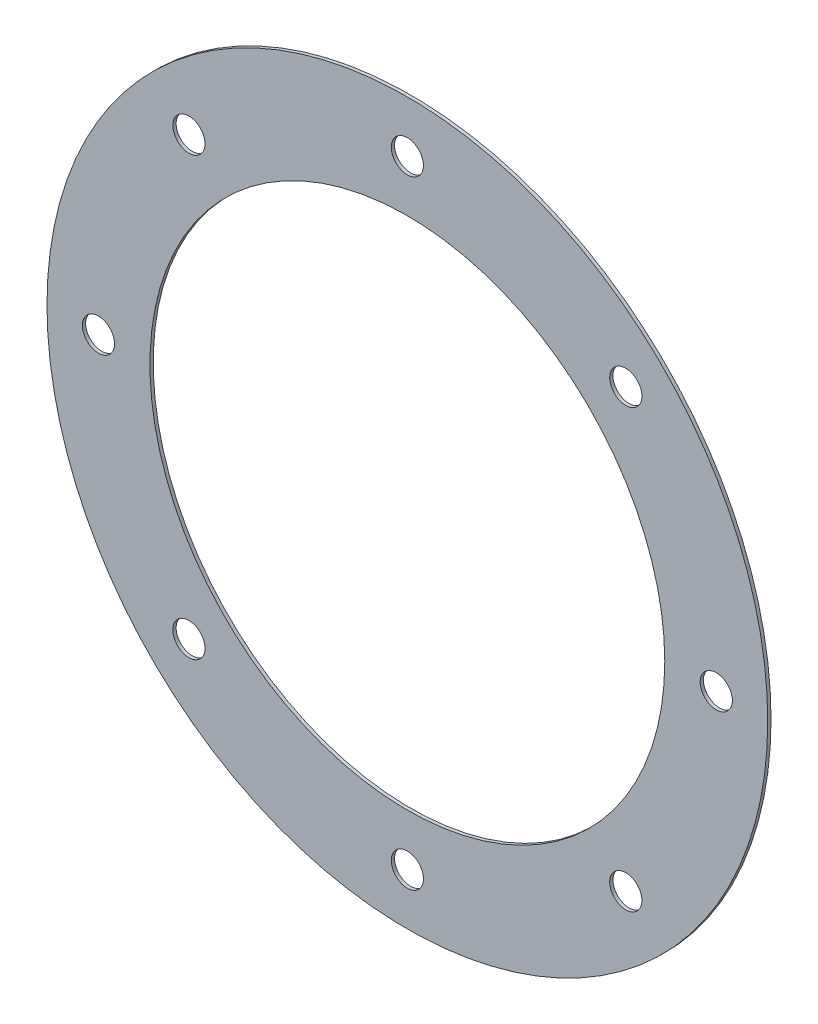
ISO-10303-21;
HEADER;
FILE_DESCRIPTION(('STEP AP214'),'2;1');
FILE_NAME('part.step','',(''),(''),'','','');
FILE_SCHEMA(('AUTOMOTIVE_DESIGN { 1 0 10303 214 1 1 1 1 }'));
ENDSEC;
DATA;
#1=APPLICATION_CONTEXT('core data for automotive mechanical design processes');
#2=APPLICATION_PROTOCOL_DEFINITION('international standard','automotive_design',2000,#1);
#3=PRODUCT_CONTEXT('',#1,'mechanical');
#4=PRODUCT('Part','Part','',(#3));
#5=PRODUCT_RELATED_PRODUCT_CATEGORY('part','',(#4));
#6=PRODUCT_DEFINITION_FORMATION('','',#4);
#7=PRODUCT_DEFINITION_CONTEXT('part definition',#1,'design');
#8=PRODUCT_DEFINITION('design','',#6,#7);
#9=PRODUCT_DEFINITION_SHAPE('','',#8);
#10=(LENGTH_UNIT() NAMED_UNIT(*) SI_UNIT(.MILLI.,.METRE.));
#11=(NAMED_UNIT(*) PLANE_ANGLE_UNIT() SI_UNIT($,.RADIAN.));
#12=(NAMED_UNIT(*) SI_UNIT($,.STERADIAN.) SOLID_ANGLE_UNIT());
#13=UNCERTAINTY_MEASURE_WITH_UNIT(LENGTH_MEASURE(1.E-05),#10,'distance_accuracy_value','');
#14=(GEOMETRIC_REPRESENTATION_CONTEXT(3) GLOBAL_UNCERTAINTY_ASSIGNED_CONTEXT((#13)) GLOBAL_UNIT_ASSIGNED_CONTEXT((#10,
#11,#12)) REPRESENTATION_CONTEXT('',''));
#15=CARTESIAN_POINT('',(0.,0.,0.));
#16=DIRECTION('',(0.,0.,1.));
#17=DIRECTION('',(1.,0.,0.));
#18=AXIS2_PLACEMENT_3D('',#15,#16,#17);
#19=CARTESIAN_POINT('',(0.,0.,0.254));
#20=DIRECTION('',(0.,0.,1.));
#21=DIRECTION('',(1.,0.,0.));
#22=AXIS2_PLACEMENT_3D('',#19,#20,#21);
#23=PLANE('',#22);
#24=CARTESIAN_POINT('',(-16.9705627484769,16.9705627484773,0.254000000000001));
#25=DIRECTION('',(0.,0.,1.));
#26=DIRECTION('',(1.,0.,0.));
#27=AXIS2_PLACEMENT_3D('',#24,#25,#26);
#28=CIRCLE('',#27,1.24999999999999);
#29=CARTESIAN_POINT('',(-15.7205627484769,16.9705627484773,0.254000000000001));
#30=VERTEX_POINT('',#29);
#31=EDGE_CURVE('E84',#30,#30,#28,.T.);
#32=ORIENTED_EDGE('',*,*,#31,.F.);
#33=EDGE_LOOP('',(#32));
#34=FACE_BOUND('',#33,.T.);
#35=CARTESIAN_POINT('',(-24.,2.51386656396706E-13,0.254000000000001));
#36=DIRECTION('',(0.,0.,1.));
#37=DIRECTION('',(1.,0.,0.));
#38=AXIS2_PLACEMENT_3D('',#35,#36,#37);
#39=CIRCLE('',#38,1.24999999999999);
#40=CARTESIAN_POINT('',(-22.75,2.51386656396706E-13,0.254000000000001));
#41=VERTEX_POINT('',#40);
#42=EDGE_CURVE('E74',#41,#41,#39,.T.);
#43=ORIENTED_EDGE('',*,*,#42,.F.);
#44=EDGE_LOOP('',(#43));
#45=FACE_BOUND('',#44,.T.);
#46=CARTESIAN_POINT('',(-16.9705627484773,-16.970562748477,0.254000000000001));
#47=DIRECTION('',(0.,0.,1.));
#48=DIRECTION('',(1.,0.,0.));
#49=AXIS2_PLACEMENT_3D('',#46,#47,#48);
#50=CIRCLE('',#49,1.24999999999999);
#51=CARTESIAN_POINT('',(-15.7205627484773,-16.970562748477,0.254000000000001));
#52=VERTEX_POINT('',#51);
#53=EDGE_CURVE('E71',#52,#52,#50,.T.);
#54=ORIENTED_EDGE('',*,*,#53,.F.);
#55=EDGE_LOOP('',(#54));
#56=FACE_BOUND('',#55,.T.);
#57=CARTESIAN_POINT('',(0.,-24.,0.254000000000001));
#58=DIRECTION('',(0.,0.,1.));
#59=DIRECTION('',(1.,0.,0.));
#60=AXIS2_PLACEMENT_3D('',#57,#58,#59);
#61=CIRCLE('',#60,1.24999999999999);
#62=CARTESIAN_POINT('',(1.24999999999999,-24.,0.254000000000001));
#63=VERTEX_POINT('',#62);
#64=EDGE_CURVE('E68',#63,#63,#61,.T.);
#65=ORIENTED_EDGE('',*,*,#64,.F.);
#66=EDGE_LOOP('',(#65));
#67=FACE_BOUND('',#66,.T.);
#68=CARTESIAN_POINT('',(16.9705627484771,-16.9705627484772,0.254000000000001));
#69=DIRECTION('',(0.,0.,1.));
#70=DIRECTION('',(1.,0.,0.));
#71=AXIS2_PLACEMENT_3D('',#68,#69,#70);
#72=CIRCLE('',#71,1.24999999999999);
#73=CARTESIAN_POINT('',(18.220562748477,-16.9705627484772,0.254000000000001));
#74=VERTEX_POINT('',#73);
#75=EDGE_CURVE('E64',#74,#74,#72,.T.);
#76=ORIENTED_EDGE('',*,*,#75,.F.);
#77=EDGE_LOOP('',(#76));
#78=FACE_BOUND('',#77,.T.);
#79=CARTESIAN_POINT('',(24.,0.,0.254000000000001));
#80=DIRECTION('',(0.,0.,1.));
#81=DIRECTION('',(1.,0.,0.));
#82=AXIS2_PLACEMENT_3D('',#79,#80,#81);
#83=CIRCLE('',#82,1.24999999999999);
#84=CARTESIAN_POINT('',(25.25,0.,0.254000000000001));
#85=VERTEX_POINT('',#84);
#86=EDGE_CURVE('E60',#85,#85,#83,.T.);
#87=ORIENTED_EDGE('',*,*,#86,.F.);
#88=EDGE_LOOP('',(#87));
#89=FACE_BOUND('',#88,.T.);
#90=CARTESIAN_POINT('',(16.9705627484772,16.9705627484771,0.254000000000001));
#91=DIRECTION('',(0.,0.,1.));
#92=DIRECTION('',(1.,0.,0.));
#93=AXIS2_PLACEMENT_3D('',#90,#91,#92);
#94=CIRCLE('',#93,1.24999999999999);
#95=CARTESIAN_POINT('',(18.2205627484772,16.9705627484771,0.254000000000001));
#96=VERTEX_POINT('',#95);
#97=EDGE_CURVE('E56',#96,#96,#94,.T.);
#98=ORIENTED_EDGE('',*,*,#97,.F.);
#99=EDGE_LOOP('',(#98));
#100=FACE_BOUND('',#99,.T.);
#101=CARTESIAN_POINT('',(0.,24.,0.254000000000001));
#102=DIRECTION('',(0.,0.,1.));
#103=DIRECTION('',(1.,0.,0.));
#104=AXIS2_PLACEMENT_3D('',#101,#102,#103);
#105=CIRCLE('',#104,1.24999999999999);
#106=CARTESIAN_POINT('',(1.24999999999999,24.,0.254000000000001));
#107=VERTEX_POINT('',#106);
#108=EDGE_CURVE('E52',#107,#107,#105,.T.);
#109=ORIENTED_EDGE('',*,*,#108,.F.);
#110=EDGE_LOOP('',(#109));
#111=FACE_BOUND('',#110,.T.);
#112=CARTESIAN_POINT('',(0.,0.,0.254));
#113=DIRECTION('',(0.,0.,1.));
#114=DIRECTION('',(1.,0.,0.));
#115=AXIS2_PLACEMENT_3D('',#112,#113,#114);
#116=CIRCLE('',#115,28.);
#117=CARTESIAN_POINT('',(28.,0.,0.254));
#118=VERTEX_POINT('',#117);
#119=EDGE_CURVE('E10',#118,#118,#116,.T.);
#120=ORIENTED_EDGE('',*,*,#119,.T.);
#121=EDGE_LOOP('',(#120));
#122=FACE_BOUND('',#121,.T.);
#123=CARTESIAN_POINT('',(0.,0.,0.254));
#124=DIRECTION('',(0.,0.,1.));
#125=DIRECTION('',(1.,0.,0.));
#126=AXIS2_PLACEMENT_3D('',#123,#124,#125);
#127=CIRCLE('',#126,20.);
#128=CARTESIAN_POINT('',(20.,0.,0.254));
#129=VERTEX_POINT('',#128);
#130=EDGE_CURVE('E43',#129,#129,#127,.T.);
#131=ORIENTED_EDGE('',*,*,#130,.F.);
#132=EDGE_LOOP('',(#131));
#133=FACE_BOUND('',#132,.T.);
#134=ADVANCED_FACE('F30',(#34,#45,#56,#67,#78,#89,#100,#111,#122,#133),#23,.T.);
#135=CARTESIAN_POINT('',(0.,0.,0.));
#136=DIRECTION('',(0.,0.,1.));
#137=DIRECTION('',(1.,0.,0.));
#138=AXIS2_PLACEMENT_3D('',#135,#136,#137);
#139=PLANE('',#138);
#140=CARTESIAN_POINT('',(-16.9705627484769,16.9705627484773,0.));
#141=DIRECTION('',(0.,0.,1.));
#142=DIRECTION('',(1.,0.,0.));
#143=AXIS2_PLACEMENT_3D('',#140,#141,#142);
#144=CIRCLE('',#143,1.24999999999999);
#145=CARTESIAN_POINT('',(-15.7205627484769,16.9705627484773,0.));
#146=VERTEX_POINT('',#145);
#147=EDGE_CURVE('E34',#146,#146,#144,.T.);
#148=ORIENTED_EDGE('',*,*,#147,.T.);
#149=EDGE_LOOP('',(#148));
#150=FACE_BOUND('',#149,.T.);
#151=CARTESIAN_POINT('',(-24.,2.51386656396706E-13,0.));
#152=DIRECTION('',(0.,0.,1.));
#153=DIRECTION('',(1.,0.,0.));
#154=AXIS2_PLACEMENT_3D('',#151,#152,#153);
#155=CIRCLE('',#154,1.24999999999999);
#156=CARTESIAN_POINT('',(-22.75,2.51386656396706E-13,0.));
#157=VERTEX_POINT('',#156);
#158=EDGE_CURVE('E72',#157,#157,#155,.T.);
#159=ORIENTED_EDGE('',*,*,#158,.T.);
#160=EDGE_LOOP('',(#159));
#161=FACE_BOUND('',#160,.T.);
#162=CARTESIAN_POINT('',(-16.9705627484773,-16.970562748477,0.));
#163=DIRECTION('',(0.,0.,1.));
#164=DIRECTION('',(1.,0.,0.));
#165=AXIS2_PLACEMENT_3D('',#162,#163,#164);
#166=CIRCLE('',#165,1.24999999999999);
#167=CARTESIAN_POINT('',(-15.7205627484773,-16.970562748477,0.));
#168=VERTEX_POINT('',#167);
#169=EDGE_CURVE('E69',#168,#168,#166,.T.);
#170=ORIENTED_EDGE('',*,*,#169,.T.);
#171=EDGE_LOOP('',(#170));
#172=FACE_BOUND('',#171,.T.);
#173=CARTESIAN_POINT('',(0.,-24.,0.));
#174=DIRECTION('',(0.,0.,1.));
#175=DIRECTION('',(1.,0.,0.));
#176=AXIS2_PLACEMENT_3D('',#173,#174,#175);
#177=CIRCLE('',#176,1.24999999999999);
#178=CARTESIAN_POINT('',(1.24999999999999,-24.,0.));
#179=VERTEX_POINT('',#178);
#180=EDGE_CURVE('E65',#179,#179,#177,.T.);
#181=ORIENTED_EDGE('',*,*,#180,.T.);
#182=EDGE_LOOP('',(#181));
#183=FACE_BOUND('',#182,.T.);
#184=CARTESIAN_POINT('',(16.9705627484771,-16.9705627484772,0.));
#185=DIRECTION('',(0.,0.,1.));
#186=DIRECTION('',(1.,0.,0.));
#187=AXIS2_PLACEMENT_3D('',#184,#185,#186);
#188=CIRCLE('',#187,1.24999999999999);
#189=CARTESIAN_POINT('',(18.220562748477,-16.9705627484772,0.));
#190=VERTEX_POINT('',#189);
#191=EDGE_CURVE('E61',#190,#190,#188,.T.);
#192=ORIENTED_EDGE('',*,*,#191,.T.);
#193=EDGE_LOOP('',(#192));
#194=FACE_BOUND('',#193,.T.);
#195=CARTESIAN_POINT('',(24.,0.,0.));
#196=DIRECTION('',(0.,0.,1.));
#197=DIRECTION('',(1.,0.,0.));
#198=AXIS2_PLACEMENT_3D('',#195,#196,#197);
#199=CIRCLE('',#198,1.24999999999999);
#200=CARTESIAN_POINT('',(25.25,0.,0.));
#201=VERTEX_POINT('',#200);
#202=EDGE_CURVE('E57',#201,#201,#199,.T.);
#203=ORIENTED_EDGE('',*,*,#202,.T.);
#204=EDGE_LOOP('',(#203));
#205=FACE_BOUND('',#204,.T.);
#206=CARTESIAN_POINT('',(16.9705627484772,16.9705627484771,0.));
#207=DIRECTION('',(0.,0.,1.));
#208=DIRECTION('',(1.,0.,0.));
#209=AXIS2_PLACEMENT_3D('',#206,#207,#208);
#210=CIRCLE('',#209,1.24999999999999);
#211=CARTESIAN_POINT('',(18.2205627484772,16.9705627484771,0.));
#212=VERTEX_POINT('',#211);
#213=EDGE_CURVE('E53',#212,#212,#210,.T.);
#214=ORIENTED_EDGE('',*,*,#213,.T.);
#215=EDGE_LOOP('',(#214));
#216=FACE_BOUND('',#215,.T.);
#217=CARTESIAN_POINT('',(0.,24.,0.));
#218=DIRECTION('',(0.,0.,1.));
#219=DIRECTION('',(1.,0.,0.));
#220=AXIS2_PLACEMENT_3D('',#217,#218,#219);
#221=CIRCLE('',#220,1.24999999999999);
#222=CARTESIAN_POINT('',(1.24999999999999,24.,0.));
#223=VERTEX_POINT('',#222);
#224=EDGE_CURVE('E49',#223,#223,#221,.T.);
#225=ORIENTED_EDGE('',*,*,#224,.T.);
#226=EDGE_LOOP('',(#225));
#227=FACE_BOUND('',#226,.T.);
#228=CARTESIAN_POINT('',(0.,0.,0.));
#229=DIRECTION('',(0.,0.,1.));
#230=DIRECTION('',(1.,0.,0.));
#231=AXIS2_PLACEMENT_3D('',#228,#229,#230);
#232=CIRCLE('',#231,28.);
#233=CARTESIAN_POINT('',(28.,0.,0.));
#234=VERTEX_POINT('',#233);
#235=EDGE_CURVE('E38',#234,#234,#232,.T.);
#236=ORIENTED_EDGE('',*,*,#235,.F.);
#237=EDGE_LOOP('',(#236));
#238=FACE_BOUND('',#237,.T.);
#239=CARTESIAN_POINT('',(0.,0.,0.));
#240=DIRECTION('',(0.,0.,1.));
#241=DIRECTION('',(1.,0.,0.));
#242=AXIS2_PLACEMENT_3D('',#239,#240,#241);
#243=CIRCLE('',#242,20.);
#244=CARTESIAN_POINT('',(20.,0.,0.));
#245=VERTEX_POINT('',#244);
#246=EDGE_CURVE('E46',#245,#245,#243,.T.);
#247=ORIENTED_EDGE('',*,*,#246,.T.);
#248=EDGE_LOOP('',(#247));
#249=FACE_BOUND('',#248,.T.);
#250=ADVANCED_FACE('F102',(#150,#161,#172,#183,#194,#205,#216,#227,#238,#249),#139,.F.);
#251=CARTESIAN_POINT('',(0.,0.,0.254));
#252=DIRECTION('',(0.,0.,-1.));
#253=DIRECTION('',(-1.,0.,0.));
#254=AXIS2_PLACEMENT_3D('',#251,#252,#253);
#255=CYLINDRICAL_SURFACE('',#254,28.);
#256=ORIENTED_EDGE('',*,*,#119,.F.);
#257=EDGE_LOOP('',(#256));
#258=FACE_BOUND('',#257,.T.);
#259=ORIENTED_EDGE('',*,*,#235,.T.);
#260=EDGE_LOOP('',(#259));
#261=FACE_BOUND('',#260,.T.);
#262=ADVANCED_FACE('F32',(#258,#261),#255,.T.);
#263=CARTESIAN_POINT('',(0.,0.,0.254));
#264=DIRECTION('',(0.,0.,-1.));
#265=DIRECTION('',(-1.,0.,0.));
#266=AXIS2_PLACEMENT_3D('',#263,#264,#265);
#267=CYLINDRICAL_SURFACE('',#266,20.);
#268=ORIENTED_EDGE('',*,*,#130,.T.);
#269=EDGE_LOOP('',(#268));
#270=FACE_BOUND('',#269,.T.);
#271=ORIENTED_EDGE('',*,*,#246,.F.);
#272=EDGE_LOOP('',(#271));
#273=FACE_BOUND('',#272,.T.);
#274=ADVANCED_FACE('F104',(#270,#273),#267,.F.);
#275=CARTESIAN_POINT('',(0.,24.,0.254));
#276=DIRECTION('',(0.,0.,1.));
#277=DIRECTION('',(1.,0.,0.));
#278=AXIS2_PLACEMENT_3D('',#275,#276,#277);
#279=CYLINDRICAL_SURFACE('',#278,1.24999999999999);
#280=ORIENTED_EDGE('',*,*,#108,.T.);
#281=EDGE_LOOP('',(#280));
#282=FACE_BOUND('',#281,.T.);
#283=ORIENTED_EDGE('',*,*,#224,.F.);
#284=EDGE_LOOP('',(#283));
#285=FACE_BOUND('',#284,.T.);
#286=ADVANCED_FACE('F106',(#282,#285),#279,.F.);
#287=CARTESIAN_POINT('',(16.9705627484772,16.9705627484771,0.254));
#288=DIRECTION('',(0.,0.,1.));
#289=DIRECTION('',(1.,0.,0.));
#290=AXIS2_PLACEMENT_3D('',#287,#288,#289);
#291=CYLINDRICAL_SURFACE('',#290,1.24999999999999);
#292=ORIENTED_EDGE('',*,*,#97,.T.);
#293=EDGE_LOOP('',(#292));
#294=FACE_BOUND('',#293,.T.);
#295=ORIENTED_EDGE('',*,*,#213,.F.);
#296=EDGE_LOOP('',(#295));
#297=FACE_BOUND('',#296,.T.);
#298=ADVANCED_FACE('F112',(#294,#297),#291,.F.);
#299=CARTESIAN_POINT('',(24.,0.,0.254));
#300=DIRECTION('',(0.,0.,1.));
#301=DIRECTION('',(1.,0.,0.));
#302=AXIS2_PLACEMENT_3D('',#299,#300,#301);
#303=CYLINDRICAL_SURFACE('',#302,1.24999999999999);
#304=ORIENTED_EDGE('',*,*,#86,.T.);
#305=EDGE_LOOP('',(#304));
#306=FACE_BOUND('',#305,.T.);
#307=ORIENTED_EDGE('',*,*,#202,.F.);
#308=EDGE_LOOP('',(#307));
#309=FACE_BOUND('',#308,.T.);
#310=ADVANCED_FACE('F148',(#306,#309),#303,.F.);
#311=CARTESIAN_POINT('',(16.9705627484771,-16.9705627484772,0.254));
#312=DIRECTION('',(0.,0.,1.));
#313=DIRECTION('',(1.,0.,0.));
#314=AXIS2_PLACEMENT_3D('',#311,#312,#313);
#315=CYLINDRICAL_SURFACE('',#314,1.24999999999999);
#316=ORIENTED_EDGE('',*,*,#75,.T.);
#317=EDGE_LOOP('',(#316));
#318=FACE_BOUND('',#317,.T.);
#319=ORIENTED_EDGE('',*,*,#191,.F.);
#320=EDGE_LOOP('',(#319));
#321=FACE_BOUND('',#320,.T.);
#322=ADVANCED_FACE('F155',(#318,#321),#315,.F.);
#323=CARTESIAN_POINT('',(0.,-24.,0.254));
#324=DIRECTION('',(0.,0.,1.));
#325=DIRECTION('',(1.,0.,0.));
#326=AXIS2_PLACEMENT_3D('',#323,#324,#325);
#327=CYLINDRICAL_SURFACE('',#326,1.24999999999999);
#328=ORIENTED_EDGE('',*,*,#64,.T.);
#329=EDGE_LOOP('',(#328));
#330=FACE_BOUND('',#329,.T.);
#331=ORIENTED_EDGE('',*,*,#180,.F.);
#332=EDGE_LOOP('',(#331));
#333=FACE_BOUND('',#332,.T.);
#334=ADVANCED_FACE('F161',(#330,#333),#327,.F.);
#335=CARTESIAN_POINT('',(-16.9705627484773,-16.970562748477,0.254));
#336=DIRECTION('',(0.,0.,1.));
#337=DIRECTION('',(1.,0.,0.));
#338=AXIS2_PLACEMENT_3D('',#335,#336,#337);
#339=CYLINDRICAL_SURFACE('',#338,1.24999999999999);
#340=ORIENTED_EDGE('',*,*,#53,.T.);
#341=EDGE_LOOP('',(#340));
#342=FACE_BOUND('',#341,.T.);
#343=ORIENTED_EDGE('',*,*,#169,.F.);
#344=EDGE_LOOP('',(#343));
#345=FACE_BOUND('',#344,.T.);
#346=ADVANCED_FACE('F165',(#342,#345),#339,.F.);
#347=CARTESIAN_POINT('',(-24.,2.51386656396706E-13,0.254));
#348=DIRECTION('',(0.,0.,1.));
#349=DIRECTION('',(1.,0.,0.));
#350=AXIS2_PLACEMENT_3D('',#347,#348,#349);
#351=CYLINDRICAL_SURFACE('',#350,1.24999999999999);
#352=ORIENTED_EDGE('',*,*,#42,.T.);
#353=EDGE_LOOP('',(#352));
#354=FACE_BOUND('',#353,.T.);
#355=ORIENTED_EDGE('',*,*,#158,.F.);
#356=EDGE_LOOP('',(#355));
#357=FACE_BOUND('',#356,.T.);
#358=ADVANCED_FACE('F169',(#354,#357),#351,.F.);
#359=CARTESIAN_POINT('',(-16.9705627484769,16.9705627484773,0.254));
#360=DIRECTION('',(0.,0.,1.));
#361=DIRECTION('',(1.,0.,0.));
#362=AXIS2_PLACEMENT_3D('',#359,#360,#361);
#363=CYLINDRICAL_SURFACE('',#362,1.24999999999999);
#364=ORIENTED_EDGE('',*,*,#31,.T.);
#365=EDGE_LOOP('',(#364));
#366=FACE_BOUND('',#365,.T.);
#367=ORIENTED_EDGE('',*,*,#147,.F.);
#368=EDGE_LOOP('',(#367));
#369=FACE_BOUND('',#368,.T.);
#370=ADVANCED_FACE('F173',(#366,#369),#363,.F.);
#371=CLOSED_SHELL('',(#134,#250,#262,#274,#286,#298,#310,#322,#334,#346,#358,#370));
#372=MANIFOLD_SOLID_BREP('B2',#371);
#373=ADVANCED_BREP_SHAPE_REPRESENTATION('',(#18,#372),#14);
#374=SHAPE_DEFINITION_REPRESENTATION(#9,#373);
ENDSEC;
END-ISO-10303-21;
